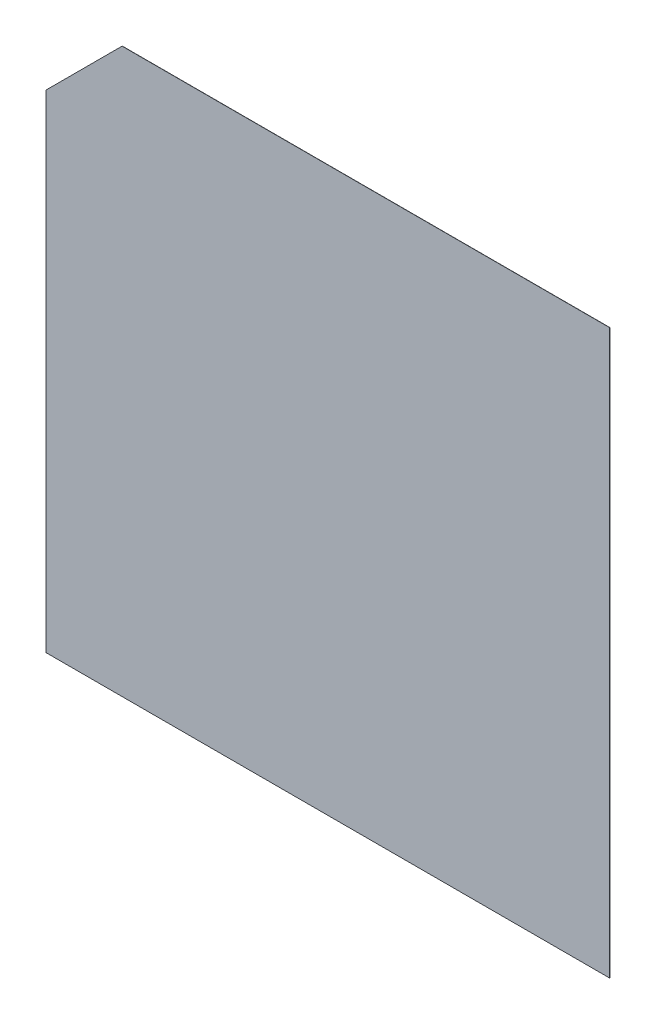
ISO-10303-21;
HEADER;
FILE_DESCRIPTION(('STEP AP214'),'2;1');
FILE_NAME('part.step','',(''),(''),'','','');
FILE_SCHEMA(('AUTOMOTIVE_DESIGN { 1 0 10303 214 1 1 1 1 }'));
ENDSEC;
DATA;
#1=APPLICATION_CONTEXT('core data for automotive mechanical design processes');
#2=APPLICATION_PROTOCOL_DEFINITION('international standard','automotive_design',2000,#1);
#3=PRODUCT_CONTEXT('',#1,'mechanical');
#4=PRODUCT('Part','Part','',(#3));
#5=PRODUCT_RELATED_PRODUCT_CATEGORY('part','',(#4));
#6=PRODUCT_DEFINITION_FORMATION('','',#4);
#7=PRODUCT_DEFINITION_CONTEXT('part definition',#1,'design');
#8=PRODUCT_DEFINITION('design','',#6,#7);
#9=PRODUCT_DEFINITION_SHAPE('','',#8);
#10=(LENGTH_UNIT() NAMED_UNIT(*) SI_UNIT(.MILLI.,.METRE.));
#11=(NAMED_UNIT(*) PLANE_ANGLE_UNIT() SI_UNIT($,.RADIAN.));
#12=(NAMED_UNIT(*) SI_UNIT($,.STERADIAN.) SOLID_ANGLE_UNIT());
#13=UNCERTAINTY_MEASURE_WITH_UNIT(LENGTH_MEASURE(1.E-05),#10,'distance_accuracy_value','');
#14=(GEOMETRIC_REPRESENTATION_CONTEXT(3) GLOBAL_UNCERTAINTY_ASSIGNED_CONTEXT((#13)) GLOBAL_UNIT_ASSIGNED_CONTEXT((#10,
#11,#12)) REPRESENTATION_CONTEXT('',''));
#15=CARTESIAN_POINT('',(0.,0.,0.));
#16=DIRECTION('',(0.,0.,1.));
#17=DIRECTION('',(1.,0.,0.));
#18=AXIS2_PLACEMENT_3D('',#15,#16,#17);
#19=CARTESIAN_POINT('',(0.,0.,0.001));
#20=DIRECTION('',(0.,0.,-1.));
#21=DIRECTION('',(-1.,0.,0.));
#22=AXIS2_PLACEMENT_3D('',#19,#20,#21);
#23=PLANE('',#22);
#24=DIRECTION('',(0.,1.,0.));
#25=VECTOR('',#24,1.);
#26=CARTESIAN_POINT('',(2.6,0.,0.001));
#27=LINE('',#26,#25);
#28=CARTESIAN_POINT('',(2.6,0.,0.001));
#29=VERTEX_POINT('',#28);
#30=CARTESIAN_POINT('',(2.6,2.6,0.001));
#31=VERTEX_POINT('',#30);
#32=EDGE_CURVE('E85',#29,#31,#27,.T.);
#33=ORIENTED_EDGE('',*,*,#32,.T.);
#34=DIRECTION('',(1.,0.,0.));
#35=VECTOR('',#34,1.);
#36=CARTESIAN_POINT('',(2.6,2.6,0.001));
#37=LINE('',#36,#35);
#38=CARTESIAN_POINT('',(0.35,2.6,0.001));
#39=VERTEX_POINT('',#38);
#40=EDGE_CURVE('E66',#31,#39,#37,.F.);
#41=ORIENTED_EDGE('',*,*,#40,.T.);
#42=DIRECTION('',(0.707106781186548,0.707106781186548,0.));
#43=VECTOR('',#42,1.);
#44=CARTESIAN_POINT('',(0.35,2.6,0.001));
#45=LINE('',#44,#43);
#46=CARTESIAN_POINT('',(0.,2.25,0.001));
#47=VERTEX_POINT('',#46);
#48=EDGE_CURVE('E60',#39,#47,#45,.F.);
#49=ORIENTED_EDGE('',*,*,#48,.T.);
#50=DIRECTION('',(0.,1.,0.));
#51=VECTOR('',#50,1.);
#52=CARTESIAN_POINT('',(0.,2.25,0.001));
#53=LINE('',#52,#51);
#54=CARTESIAN_POINT('',(0.,0.,0.001));
#55=VERTEX_POINT('',#54);
#56=EDGE_CURVE('E63',#47,#55,#53,.F.);
#57=ORIENTED_EDGE('',*,*,#56,.T.);
#58=DIRECTION('',(1.,0.,0.));
#59=VECTOR('',#58,1.);
#60=CARTESIAN_POINT('',(0.,0.,0.001));
#61=LINE('',#60,#59);
#62=EDGE_CURVE('E93',#55,#29,#61,.T.);
#63=ORIENTED_EDGE('',*,*,#62,.T.);
#64=EDGE_LOOP('',(#33,#41,#49,#57,#63));
#65=FACE_BOUND('',#64,.T.);
#66=ADVANCED_FACE('F17',(#65),#23,.F.);
#67=CARTESIAN_POINT('',(0.,2.25,0.));
#68=DIRECTION('',(1.,0.,0.));
#69=DIRECTION('',(0.,0.,-1.));
#70=AXIS2_PLACEMENT_3D('',#67,#68,#69);
#71=PLANE('',#70);
#72=DIRECTION('',(0.,0.,-1.));
#73=VECTOR('',#72,1.);
#74=CARTESIAN_POINT('',(0.,0.,0.));
#75=LINE('',#74,#73);
#76=CARTESIAN_POINT('',(0.,0.,0.));
#77=VERTEX_POINT('',#76);
#78=EDGE_CURVE('E76',#77,#55,#75,.F.);
#79=ORIENTED_EDGE('',*,*,#78,.T.);
#80=ORIENTED_EDGE('',*,*,#56,.F.);
#81=DIRECTION('',(0.,0.,-1.));
#82=VECTOR('',#81,1.);
#83=CARTESIAN_POINT('',(0.,2.25,0.));
#84=LINE('',#83,#82);
#85=CARTESIAN_POINT('',(0.,2.25,0.));
#86=VERTEX_POINT('',#85);
#87=EDGE_CURVE('E20',#47,#86,#84,.T.);
#88=ORIENTED_EDGE('',*,*,#87,.T.);
#89=DIRECTION('',(0.,1.,0.));
#90=VECTOR('',#89,1.);
#91=CARTESIAN_POINT('',(0.,0.,0.));
#92=LINE('',#91,#90);
#93=EDGE_CURVE('E90',#77,#86,#92,.T.);
#94=ORIENTED_EDGE('',*,*,#93,.F.);
#95=EDGE_LOOP('',(#79,#80,#88,#94));
#96=FACE_BOUND('',#95,.T.);
#97=ADVANCED_FACE('F73',(#96),#71,.F.);
#98=CARTESIAN_POINT('',(0.35,2.6,0.));
#99=DIRECTION('',(0.707106781186548,-0.707106781186548,0.));
#100=DIRECTION('',(0.707106781186548,0.707106781186548,0.));
#101=AXIS2_PLACEMENT_3D('',#98,#99,#100);
#102=PLANE('',#101);
#103=ORIENTED_EDGE('',*,*,#87,.F.);
#104=ORIENTED_EDGE('',*,*,#48,.F.);
#105=DIRECTION('',(0.,0.,1.));
#106=VECTOR('',#105,1.);
#107=CARTESIAN_POINT('',(0.35,2.6,0.));
#108=LINE('',#107,#106);
#109=CARTESIAN_POINT('',(0.35,2.6,0.));
#110=VERTEX_POINT('',#109);
#111=EDGE_CURVE('E83',#39,#110,#108,.F.);
#112=ORIENTED_EDGE('',*,*,#111,.T.);
#113=DIRECTION('',(0.707106781186547,0.707106781186548,0.));
#114=VECTOR('',#113,1.);
#115=CARTESIAN_POINT('',(0.,2.25,0.));
#116=LINE('',#115,#114);
#117=EDGE_CURVE('E81',#86,#110,#116,.T.);
#118=ORIENTED_EDGE('',*,*,#117,.F.);
#119=EDGE_LOOP('',(#103,#104,#112,#118));
#120=FACE_BOUND('',#119,.T.);
#121=ADVANCED_FACE('F79',(#120),#102,.F.);
#122=CARTESIAN_POINT('',(2.6,2.6,0.));
#123=DIRECTION('',(0.,-1.,0.));
#124=DIRECTION('',(0.,0.,-1.));
#125=AXIS2_PLACEMENT_3D('',#122,#123,#124);
#126=PLANE('',#125);
#127=ORIENTED_EDGE('',*,*,#111,.F.);
#128=ORIENTED_EDGE('',*,*,#40,.F.);
#129=DIRECTION('',(0.,0.,-1.));
#130=VECTOR('',#129,1.);
#131=CARTESIAN_POINT('',(2.6,2.6,0.));
#132=LINE('',#131,#130);
#133=CARTESIAN_POINT('',(2.6,2.6,0.));
#134=VERTEX_POINT('',#133);
#135=EDGE_CURVE('E95',#31,#134,#132,.T.);
#136=ORIENTED_EDGE('',*,*,#135,.T.);
#137=DIRECTION('',(-1.,0.,0.));
#138=VECTOR('',#137,1.);
#139=CARTESIAN_POINT('',(0.,2.6,0.));
#140=LINE('',#139,#138);
#141=EDGE_CURVE('E88',#110,#134,#140,.F.);
#142=ORIENTED_EDGE('',*,*,#141,.F.);
#143=EDGE_LOOP('',(#127,#128,#136,#142));
#144=FACE_BOUND('',#143,.T.);
#145=ADVANCED_FACE('F109',(#144),#126,.F.);
#146=CARTESIAN_POINT('',(2.6,0.,0.));
#147=DIRECTION('',(-1.,0.,0.));
#148=DIRECTION('',(0.,0.,1.));
#149=AXIS2_PLACEMENT_3D('',#146,#147,#148);
#150=PLANE('',#149);
#151=ORIENTED_EDGE('',*,*,#135,.F.);
#152=ORIENTED_EDGE('',*,*,#32,.F.);
#153=DIRECTION('',(0.,0.,1.));
#154=VECTOR('',#153,1.);
#155=CARTESIAN_POINT('',(2.6,0.,0.));
#156=LINE('',#155,#154);
#157=CARTESIAN_POINT('',(2.6,0.,0.));
#158=VERTEX_POINT('',#157);
#159=EDGE_CURVE('E35',#29,#158,#156,.F.);
#160=ORIENTED_EDGE('',*,*,#159,.T.);
#161=DIRECTION('',(0.,1.,0.));
#162=VECTOR('',#161,1.);
#163=CARTESIAN_POINT('',(2.6,0.,0.));
#164=LINE('',#163,#162);
#165=EDGE_CURVE('E26',#134,#158,#164,.F.);
#166=ORIENTED_EDGE('',*,*,#165,.F.);
#167=EDGE_LOOP('',(#151,#152,#160,#166));
#168=FACE_BOUND('',#167,.T.);
#169=ADVANCED_FACE('F104',(#168),#150,.F.);
#170=CARTESIAN_POINT('',(0.,0.,0.));
#171=DIRECTION('',(0.,1.,0.));
#172=DIRECTION('',(0.,0.,1.));
#173=AXIS2_PLACEMENT_3D('',#170,#171,#172);
#174=PLANE('',#173);
#175=ORIENTED_EDGE('',*,*,#159,.F.);
#176=ORIENTED_EDGE('',*,*,#62,.F.);
#177=ORIENTED_EDGE('',*,*,#78,.F.);
#178=DIRECTION('',(-1.,0.,0.));
#179=VECTOR('',#178,1.);
#180=CARTESIAN_POINT('',(0.,0.,0.));
#181=LINE('',#180,#179);
#182=EDGE_CURVE('E11',#158,#77,#181,.T.);
#183=ORIENTED_EDGE('',*,*,#182,.F.);
#184=EDGE_LOOP('',(#175,#176,#177,#183));
#185=FACE_BOUND('',#184,.T.);
#186=ADVANCED_FACE('F105',(#185),#174,.F.);
#187=CARTESIAN_POINT('',(0.,0.,0.));
#188=DIRECTION('',(0.,0.,-1.));
#189=DIRECTION('',(-1.,0.,0.));
#190=AXIS2_PLACEMENT_3D('',#187,#188,#189);
#191=PLANE('',#190);
#192=ORIENTED_EDGE('',*,*,#165,.T.);
#193=ORIENTED_EDGE('',*,*,#182,.T.);
#194=ORIENTED_EDGE('',*,*,#93,.T.);
#195=ORIENTED_EDGE('',*,*,#117,.T.);
#196=ORIENTED_EDGE('',*,*,#141,.T.);
#197=EDGE_LOOP('',(#192,#193,#194,#195,#196));
#198=FACE_BOUND('',#197,.T.);
#199=ADVANCED_FACE('F108',(#198),#191,.T.);
#200=CLOSED_SHELL('',(#66,#97,#121,#145,#169,#186,#199));
#201=MANIFOLD_SOLID_BREP('B1',#200);
#202=ADVANCED_BREP_SHAPE_REPRESENTATION('',(#18,#201),#14);
#203=SHAPE_DEFINITION_REPRESENTATION(#9,#202);
ENDSEC;
END-ISO-10303-21;
